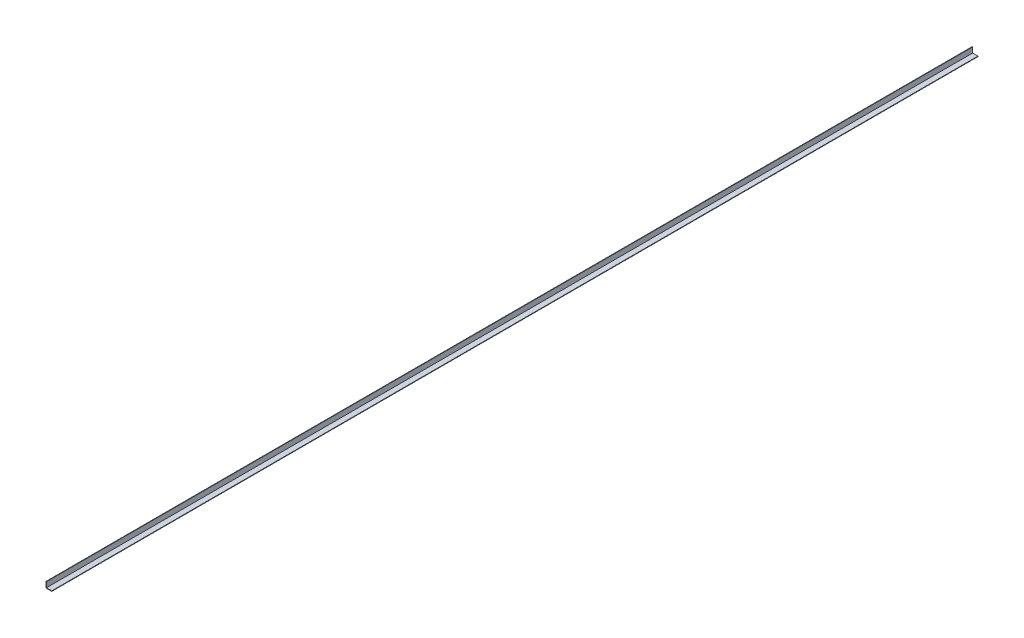
ISO-10303-21;
HEADER;
FILE_DESCRIPTION(('STEP AP214'),'2;1');
FILE_NAME('part.step','',(''),(''),'','','');
FILE_SCHEMA(('AUTOMOTIVE_DESIGN { 1 0 10303 214 1 1 1 1 }'));
ENDSEC;
DATA;
#1=APPLICATION_CONTEXT('core data for automotive mechanical design processes');
#2=APPLICATION_PROTOCOL_DEFINITION('international standard','automotive_design',2000,#1);
#3=PRODUCT_CONTEXT('',#1,'mechanical');
#4=PRODUCT('Part','Part','',(#3));
#5=PRODUCT_RELATED_PRODUCT_CATEGORY('part','',(#4));
#6=PRODUCT_DEFINITION_FORMATION('','',#4);
#7=PRODUCT_DEFINITION_CONTEXT('part definition',#1,'design');
#8=PRODUCT_DEFINITION('design','',#6,#7);
#9=PRODUCT_DEFINITION_SHAPE('','',#8);
#10=(LENGTH_UNIT() NAMED_UNIT(*) SI_UNIT(.MILLI.,.METRE.));
#11=(NAMED_UNIT(*) PLANE_ANGLE_UNIT() SI_UNIT($,.RADIAN.));
#12=(NAMED_UNIT(*) SI_UNIT($,.STERADIAN.) SOLID_ANGLE_UNIT());
#13=UNCERTAINTY_MEASURE_WITH_UNIT(LENGTH_MEASURE(1.E-05),#10,'distance_accuracy_value','');
#14=(GEOMETRIC_REPRESENTATION_CONTEXT(3) GLOBAL_UNCERTAINTY_ASSIGNED_CONTEXT((#13)) GLOBAL_UNIT_ASSIGNED_CONTEXT((#10,
#11,#12)) REPRESENTATION_CONTEXT('',''));
#15=CARTESIAN_POINT('',(0.,0.,0.));
#16=DIRECTION('',(0.,0.,1.));
#17=DIRECTION('',(1.,0.,0.));
#18=AXIS2_PLACEMENT_3D('',#15,#16,#17);
#19=CARTESIAN_POINT('',(3.18,38.1,-6100.));
#20=DIRECTION('',(0.,1.,0.));
#21=DIRECTION('',(0.,0.,1.));
#22=AXIS2_PLACEMENT_3D('',#19,#20,#21);
#23=PLANE('',#22);
#24=DIRECTION('',(-1.,0.,0.));
#25=VECTOR('',#24,1.);
#26=CARTESIAN_POINT('',(3.18,38.1,0.));
#27=LINE('',#26,#25);
#28=CARTESIAN_POINT('',(3.18,38.1,0.));
#29=VERTEX_POINT('',#28);
#30=CARTESIAN_POINT('',(0.,38.1,0.));
#31=VERTEX_POINT('',#30);
#32=EDGE_CURVE('E118',#29,#31,#27,.T.);
#33=ORIENTED_EDGE('',*,*,#32,.F.);
#34=DIRECTION('',(0.,0.,1.));
#35=VECTOR('',#34,1.);
#36=CARTESIAN_POINT('',(3.18,38.1,-6100.));
#37=LINE('',#36,#35);
#38=CARTESIAN_POINT('',(3.18,38.1,-6100.));
#39=VERTEX_POINT('',#38);
#40=EDGE_CURVE('E11',#39,#29,#37,.T.);
#41=ORIENTED_EDGE('',*,*,#40,.F.);
#42=DIRECTION('',(-1.,0.,0.));
#43=VECTOR('',#42,1.);
#44=CARTESIAN_POINT('',(3.18,38.1,-6100.));
#45=LINE('',#44,#43);
#46=CARTESIAN_POINT('',(0.,38.1,-6100.));
#47=VERTEX_POINT('',#46);
#48=EDGE_CURVE('E132',#39,#47,#45,.T.);
#49=ORIENTED_EDGE('',*,*,#48,.T.);
#50=DIRECTION('',(0.,0.,1.));
#51=VECTOR('',#50,1.);
#52=CARTESIAN_POINT('',(0.,38.1,-6100.));
#53=LINE('',#52,#51);
#54=EDGE_CURVE('E36',#47,#31,#53,.T.);
#55=ORIENTED_EDGE('',*,*,#54,.T.);
#56=EDGE_LOOP('',(#33,#41,#49,#55));
#57=FACE_BOUND('',#56,.T.);
#58=ADVANCED_FACE('F33',(#57),#23,.T.);
#59=CARTESIAN_POINT('',(3.18,3.18,-6100.));
#60=DIRECTION('',(1.,0.,0.));
#61=DIRECTION('',(0.,1.,0.));
#62=AXIS2_PLACEMENT_3D('',#59,#60,#61);
#63=PLANE('',#62);
#64=DIRECTION('',(0.,1.,0.));
#65=VECTOR('',#64,1.);
#66=CARTESIAN_POINT('',(3.18,3.18,0.));
#67=LINE('',#66,#65);
#68=CARTESIAN_POINT('',(3.18,3.18,0.));
#69=VERTEX_POINT('',#68);
#70=EDGE_CURVE('E130',#69,#29,#67,.T.);
#71=ORIENTED_EDGE('',*,*,#70,.F.);
#72=DIRECTION('',(0.,0.,1.));
#73=VECTOR('',#72,1.);
#74=CARTESIAN_POINT('',(3.18,3.18,-6100.));
#75=LINE('',#74,#73);
#76=CARTESIAN_POINT('',(3.18,3.18,-6100.));
#77=VERTEX_POINT('',#76);
#78=EDGE_CURVE('E42',#77,#69,#75,.T.);
#79=ORIENTED_EDGE('',*,*,#78,.F.);
#80=DIRECTION('',(0.,1.,0.));
#81=VECTOR('',#80,1.);
#82=CARTESIAN_POINT('',(3.18,3.18,-6100.));
#83=LINE('',#82,#81);
#84=EDGE_CURVE('E108',#77,#39,#83,.T.);
#85=ORIENTED_EDGE('',*,*,#84,.T.);
#86=ORIENTED_EDGE('',*,*,#40,.T.);
#87=EDGE_LOOP('',(#71,#79,#85,#86));
#88=FACE_BOUND('',#87,.T.);
#89=ADVANCED_FACE('F140',(#88),#63,.T.);
#90=CARTESIAN_POINT('',(38.1,3.18,-6100.));
#91=DIRECTION('',(0.,1.,0.));
#92=DIRECTION('',(-1.,0.,0.));
#93=AXIS2_PLACEMENT_3D('',#90,#91,#92);
#94=PLANE('',#93);
#95=DIRECTION('',(-1.,0.,0.));
#96=VECTOR('',#95,1.);
#97=CARTESIAN_POINT('',(38.1,3.18,0.));
#98=LINE('',#97,#96);
#99=CARTESIAN_POINT('',(38.1,3.18,0.));
#100=VERTEX_POINT('',#99);
#101=EDGE_CURVE('E95',#100,#69,#98,.T.);
#102=ORIENTED_EDGE('',*,*,#101,.F.);
#103=DIRECTION('',(0.,0.,1.));
#104=VECTOR('',#103,1.);
#105=CARTESIAN_POINT('',(38.1,3.18,-6100.));
#106=LINE('',#105,#104);
#107=CARTESIAN_POINT('',(38.1,3.18,-6100.));
#108=VERTEX_POINT('',#107);
#109=EDGE_CURVE('E90',#108,#100,#106,.T.);
#110=ORIENTED_EDGE('',*,*,#109,.F.);
#111=DIRECTION('',(-1.,0.,0.));
#112=VECTOR('',#111,1.);
#113=CARTESIAN_POINT('',(38.1,3.18,-6100.));
#114=LINE('',#113,#112);
#115=EDGE_CURVE('E93',#108,#77,#114,.T.);
#116=ORIENTED_EDGE('',*,*,#115,.T.);
#117=ORIENTED_EDGE('',*,*,#78,.T.);
#118=EDGE_LOOP('',(#102,#110,#116,#117));
#119=FACE_BOUND('',#118,.T.);
#120=ADVANCED_FACE('F92',(#119),#94,.T.);
#121=CARTESIAN_POINT('',(38.1,0.,-6100.));
#122=DIRECTION('',(1.,0.,0.));
#123=DIRECTION('',(0.,0.,-1.));
#124=AXIS2_PLACEMENT_3D('',#121,#122,#123);
#125=PLANE('',#124);
#126=DIRECTION('',(0.,1.,0.));
#127=VECTOR('',#126,1.);
#128=CARTESIAN_POINT('',(38.1,0.,0.));
#129=LINE('',#128,#127);
#130=CARTESIAN_POINT('',(38.1,0.,0.));
#131=VERTEX_POINT('',#130);
#132=EDGE_CURVE('E127',#131,#100,#129,.T.);
#133=ORIENTED_EDGE('',*,*,#132,.F.);
#134=DIRECTION('',(0.,0.,1.));
#135=VECTOR('',#134,1.);
#136=CARTESIAN_POINT('',(38.1,0.,-6100.));
#137=LINE('',#136,#135);
#138=CARTESIAN_POINT('',(38.1,0.,-6100.));
#139=VERTEX_POINT('',#138);
#140=EDGE_CURVE('E100',#139,#131,#137,.T.);
#141=ORIENTED_EDGE('',*,*,#140,.F.);
#142=DIRECTION('',(0.,1.,0.));
#143=VECTOR('',#142,1.);
#144=CARTESIAN_POINT('',(38.1,0.,-6100.));
#145=LINE('',#144,#143);
#146=EDGE_CURVE('E106',#139,#108,#145,.T.);
#147=ORIENTED_EDGE('',*,*,#146,.T.);
#148=ORIENTED_EDGE('',*,*,#109,.T.);
#149=EDGE_LOOP('',(#133,#141,#147,#148));
#150=FACE_BOUND('',#149,.T.);
#151=ADVANCED_FACE('F110',(#150),#125,.T.);
#152=CARTESIAN_POINT('',(0.,0.,-6100.));
#153=DIRECTION('',(0.,-1.,0.));
#154=DIRECTION('',(0.,0.,-1.));
#155=AXIS2_PLACEMENT_3D('',#152,#153,#154);
#156=PLANE('',#155);
#157=DIRECTION('',(1.,0.,0.));
#158=VECTOR('',#157,1.);
#159=CARTESIAN_POINT('',(0.,0.,0.));
#160=LINE('',#159,#158);
#161=CARTESIAN_POINT('',(0.,0.,0.));
#162=VERTEX_POINT('',#161);
#163=EDGE_CURVE('E124',#162,#131,#160,.T.);
#164=ORIENTED_EDGE('',*,*,#163,.F.);
#165=DIRECTION('',(0.,0.,1.));
#166=VECTOR('',#165,1.);
#167=CARTESIAN_POINT('',(0.,0.,-6100.));
#168=LINE('',#167,#166);
#169=CARTESIAN_POINT('',(0.,0.,-6100.));
#170=VERTEX_POINT('',#169);
#171=EDGE_CURVE('E135',#170,#162,#168,.T.);
#172=ORIENTED_EDGE('',*,*,#171,.F.);
#173=DIRECTION('',(1.,0.,0.));
#174=VECTOR('',#173,1.);
#175=CARTESIAN_POINT('',(0.,0.,-6100.));
#176=LINE('',#175,#174);
#177=EDGE_CURVE('E111',#170,#139,#176,.T.);
#178=ORIENTED_EDGE('',*,*,#177,.T.);
#179=ORIENTED_EDGE('',*,*,#140,.T.);
#180=EDGE_LOOP('',(#164,#172,#178,#179));
#181=FACE_BOUND('',#180,.T.);
#182=ADVANCED_FACE('F153',(#181),#156,.T.);
#183=CARTESIAN_POINT('',(0.,38.1,-6100.));
#184=DIRECTION('',(-1.,0.,0.));
#185=DIRECTION('',(0.,-1.,0.));
#186=AXIS2_PLACEMENT_3D('',#183,#184,#185);
#187=PLANE('',#186);
#188=DIRECTION('',(0.,-1.,0.));
#189=VECTOR('',#188,1.);
#190=CARTESIAN_POINT('',(0.,38.1,0.));
#191=LINE('',#190,#189);
#192=EDGE_CURVE('E121',#31,#162,#191,.T.);
#193=ORIENTED_EDGE('',*,*,#192,.F.);
#194=ORIENTED_EDGE('',*,*,#54,.F.);
#195=DIRECTION('',(0.,-1.,0.));
#196=VECTOR('',#195,1.);
#197=CARTESIAN_POINT('',(0.,38.1,-6100.));
#198=LINE('',#197,#196);
#199=EDGE_CURVE('E113',#47,#170,#198,.T.);
#200=ORIENTED_EDGE('',*,*,#199,.T.);
#201=ORIENTED_EDGE('',*,*,#171,.T.);
#202=EDGE_LOOP('',(#193,#194,#200,#201));
#203=FACE_BOUND('',#202,.T.);
#204=ADVANCED_FACE('F137',(#203),#187,.T.);
#205=CARTESIAN_POINT('',(0.,0.,-6100.));
#206=DIRECTION('',(0.,0.,1.));
#207=DIRECTION('',(1.,0.,0.));
#208=AXIS2_PLACEMENT_3D('',#205,#206,#207);
#209=PLANE('',#208);
#210=ORIENTED_EDGE('',*,*,#48,.F.);
#211=ORIENTED_EDGE('',*,*,#84,.F.);
#212=ORIENTED_EDGE('',*,*,#115,.F.);
#213=ORIENTED_EDGE('',*,*,#146,.F.);
#214=ORIENTED_EDGE('',*,*,#177,.F.);
#215=ORIENTED_EDGE('',*,*,#199,.F.);
#216=EDGE_LOOP('',(#210,#211,#212,#213,#214,#215));
#217=FACE_BOUND('',#216,.T.);
#218=ADVANCED_FACE('F104',(#217),#209,.F.);
#219=CARTESIAN_POINT('',(0.,0.,0.));
#220=DIRECTION('',(0.,0.,1.));
#221=DIRECTION('',(1.,0.,0.));
#222=AXIS2_PLACEMENT_3D('',#219,#220,#221);
#223=PLANE('',#222);
#224=ORIENTED_EDGE('',*,*,#32,.T.);
#225=ORIENTED_EDGE('',*,*,#192,.T.);
#226=ORIENTED_EDGE('',*,*,#163,.T.);
#227=ORIENTED_EDGE('',*,*,#132,.T.);
#228=ORIENTED_EDGE('',*,*,#101,.T.);
#229=ORIENTED_EDGE('',*,*,#70,.T.);
#230=EDGE_LOOP('',(#224,#225,#226,#227,#228,#229));
#231=FACE_BOUND('',#230,.T.);
#232=ADVANCED_FACE('F139',(#231),#223,.T.);
#233=CLOSED_SHELL('',(#58,#89,#120,#151,#182,#204,#218,#232));
#234=MANIFOLD_SOLID_BREP('B2',#233);
#235=ADVANCED_BREP_SHAPE_REPRESENTATION('',(#18,#234),#14);
#236=SHAPE_DEFINITION_REPRESENTATION(#9,#235);
ENDSEC;
END-ISO-10303-21;
